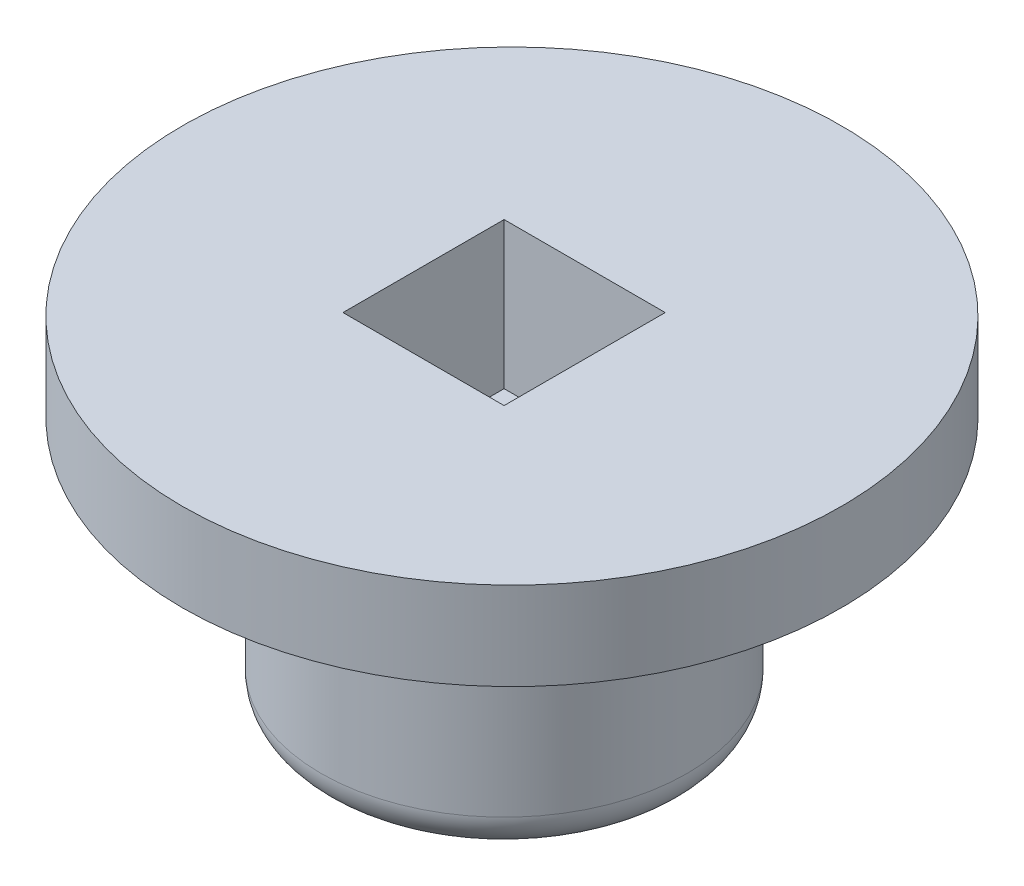
ISO-10303-21;
HEADER;
FILE_DESCRIPTION(('STEP AP214'),'2;1');
FILE_NAME('part.step','',(''),(''),'','','');
FILE_SCHEMA(('AUTOMOTIVE_DESIGN { 1 0 10303 214 1 1 1 1 }'));
ENDSEC;
DATA;
#1=APPLICATION_CONTEXT('core data for automotive mechanical design processes');
#2=APPLICATION_PROTOCOL_DEFINITION('international standard','automotive_design',2000,#1);
#3=PRODUCT_CONTEXT('',#1,'mechanical');
#4=PRODUCT('Part','Part','',(#3));
#5=PRODUCT_RELATED_PRODUCT_CATEGORY('part','',(#4));
#6=PRODUCT_DEFINITION_FORMATION('','',#4);
#7=PRODUCT_DEFINITION_CONTEXT('part definition',#1,'design');
#8=PRODUCT_DEFINITION('design','',#6,#7);
#9=PRODUCT_DEFINITION_SHAPE('','',#8);
#10=(LENGTH_UNIT() NAMED_UNIT(*) SI_UNIT(.MILLI.,.METRE.));
#11=(NAMED_UNIT(*) PLANE_ANGLE_UNIT() SI_UNIT($,.RADIAN.));
#12=(NAMED_UNIT(*) SI_UNIT($,.STERADIAN.) SOLID_ANGLE_UNIT());
#13=UNCERTAINTY_MEASURE_WITH_UNIT(LENGTH_MEASURE(1.E-05),#10,'distance_accuracy_value','');
#14=(GEOMETRIC_REPRESENTATION_CONTEXT(3) GLOBAL_UNCERTAINTY_ASSIGNED_CONTEXT((#13)) GLOBAL_UNIT_ASSIGNED_CONTEXT((#10,
#11,#12)) REPRESENTATION_CONTEXT('',''));
#15=CARTESIAN_POINT('',(0.,0.,0.));
#16=DIRECTION('',(0.,0.,1.));
#17=DIRECTION('',(1.,0.,0.));
#18=AXIS2_PLACEMENT_3D('',#15,#16,#17);
#19=CARTESIAN_POINT('',(0.,3.5,0.));
#20=DIRECTION('',(0.,-1.,0.));
#21=DIRECTION('',(0.,0.,-1.));
#22=AXIS2_PLACEMENT_3D('',#19,#20,#21);
#23=CYLINDRICAL_SURFACE('',#22,2.5);
#24=CARTESIAN_POINT('',(0.,0.5,0.));
#25=DIRECTION('',(0.,1.,0.));
#26=DIRECTION('',(0.,0.,1.));
#27=AXIS2_PLACEMENT_3D('',#24,#25,#26);
#28=CIRCLE('',#27,2.5);
#29=CARTESIAN_POINT('',(0.,0.5,2.5));
#30=VERTEX_POINT('',#29);
#31=EDGE_CURVE('E48',#30,#30,#28,.T.);
#32=ORIENTED_EDGE('',*,*,#31,.T.);
#33=EDGE_LOOP('',(#32));
#34=FACE_BOUND('',#33,.T.);
#35=CARTESIAN_POINT('',(0.,3.5,0.));
#36=DIRECTION('',(0.,1.,0.));
#37=DIRECTION('',(0.,0.,1.));
#38=AXIS2_PLACEMENT_3D('',#35,#36,#37);
#39=CIRCLE('',#38,2.5);
#40=CARTESIAN_POINT('',(0.,3.5,2.5));
#41=VERTEX_POINT('',#40);
#42=EDGE_CURVE('E135',#41,#41,#39,.T.);
#43=ORIENTED_EDGE('',*,*,#42,.F.);
#44=EDGE_LOOP('',(#43));
#45=FACE_BOUND('',#44,.T.);
#46=ADVANCED_FACE('F39',(#34,#45),#23,.T.);
#47=CARTESIAN_POINT('',(0.,0.,0.));
#48=DIRECTION('',(0.,1.,0.));
#49=DIRECTION('',(0.,0.,1.));
#50=AXIS2_PLACEMENT_3D('',#47,#48,#49);
#51=PLANE('',#50);
#52=CARTESIAN_POINT('',(0.,0.,0.));
#53=DIRECTION('',(0.,1.,0.));
#54=DIRECTION('',(0.,0.,1.));
#55=AXIS2_PLACEMENT_3D('',#52,#53,#54);
#56=CIRCLE('',#55,2.);
#57=CARTESIAN_POINT('',(0.,0.,2.));
#58=VERTEX_POINT('',#57);
#59=EDGE_CURVE('E11',#58,#58,#56,.F.);
#60=ORIENTED_EDGE('',*,*,#59,.T.);
#61=EDGE_LOOP('',(#60));
#62=FACE_BOUND('',#61,.T.);
#63=ADVANCED_FACE('F155',(#62),#51,.F.);
#64=CARTESIAN_POINT('',(0.0948799538174616,4.7,-0.0120273730239729));
#65=DIRECTION('',(0.,-1.,0.));
#66=DIRECTION('',(0.,0.,-1.));
#67=AXIS2_PLACEMENT_3D('',#64,#65,#66);
#68=CYLINDRICAL_SURFACE('',#67,4.5);
#69=CARTESIAN_POINT('',(0.0948799538174616,4.7,-0.0120273730239729));
#70=DIRECTION('',(0.,1.,0.));
#71=DIRECTION('',(0.,0.,1.));
#72=AXIS2_PLACEMENT_3D('',#69,#70,#71);
#73=CIRCLE('',#72,4.5);
#74=CARTESIAN_POINT('',(0.0948799538174616,4.7,4.48797262697603));
#75=VERTEX_POINT('',#74);
#76=EDGE_CURVE('E131',#75,#75,#73,.T.);
#77=ORIENTED_EDGE('',*,*,#76,.F.);
#78=EDGE_LOOP('',(#77));
#79=FACE_BOUND('',#78,.T.);
#80=CARTESIAN_POINT('',(0.0948799538174616,3.5,-0.0120273730239729));
#81=DIRECTION('',(0.,1.,0.));
#82=DIRECTION('',(0.,0.,1.));
#83=AXIS2_PLACEMENT_3D('',#80,#81,#82);
#84=CIRCLE('',#83,4.5);
#85=CARTESIAN_POINT('',(0.0948799538174616,3.5,4.48797262697603));
#86=VERTEX_POINT('',#85);
#87=EDGE_CURVE('E126',#86,#86,#84,.T.);
#88=ORIENTED_EDGE('',*,*,#87,.T.);
#89=EDGE_LOOP('',(#88));
#90=FACE_BOUND('',#89,.T.);
#91=ADVANCED_FACE('F159',(#79,#90),#68,.T.);
#92=CARTESIAN_POINT('',(0.0948799538174616,4.7,-0.0120273730239729));
#93=DIRECTION('',(0.,1.,0.));
#94=DIRECTION('',(0.,0.,1.));
#95=AXIS2_PLACEMENT_3D('',#92,#93,#94);
#96=PLANE('',#95);
#97=DIRECTION('',(0.,0.,1.));
#98=VECTOR('',#97,1.);
#99=CARTESIAN_POINT('',(-1.1,4.7,1.1));
#100=LINE('',#99,#98);
#101=CARTESIAN_POINT('',(-1.1,4.7,-1.1));
#102=VERTEX_POINT('',#101);
#103=CARTESIAN_POINT('',(-1.1,4.7,1.1));
#104=VERTEX_POINT('',#103);
#105=EDGE_CURVE('E55',#102,#104,#100,.T.);
#106=ORIENTED_EDGE('',*,*,#105,.F.);
#107=DIRECTION('',(-1.,0.,0.));
#108=VECTOR('',#107,1.);
#109=CARTESIAN_POINT('',(1.1,4.7,-1.1));
#110=LINE('',#109,#108);
#111=CARTESIAN_POINT('',(1.1,4.7,-1.1));
#112=VERTEX_POINT('',#111);
#113=EDGE_CURVE('E110',#112,#102,#110,.T.);
#114=ORIENTED_EDGE('',*,*,#113,.F.);
#115=DIRECTION('',(0.,0.,-1.));
#116=VECTOR('',#115,1.);
#117=CARTESIAN_POINT('',(1.1,4.7,1.1));
#118=LINE('',#117,#116);
#119=CARTESIAN_POINT('',(1.1,4.7,1.1));
#120=VERTEX_POINT('',#119);
#121=EDGE_CURVE('E119',#120,#112,#118,.T.);
#122=ORIENTED_EDGE('',*,*,#121,.F.);
#123=DIRECTION('',(1.,0.,0.));
#124=VECTOR('',#123,1.);
#125=CARTESIAN_POINT('',(1.1,4.7,1.1));
#126=LINE('',#125,#124);
#127=EDGE_CURVE('E90',#104,#120,#126,.T.);
#128=ORIENTED_EDGE('',*,*,#127,.F.);
#129=EDGE_LOOP('',(#106,#114,#122,#128));
#130=FACE_BOUND('',#129,.T.);
#131=ORIENTED_EDGE('',*,*,#76,.T.);
#132=EDGE_LOOP('',(#131));
#133=FACE_BOUND('',#132,.T.);
#134=ADVANCED_FACE('F165',(#130,#133),#96,.T.);
#135=CARTESIAN_POINT('',(0.0948799538174616,3.5,-0.0120273730239729));
#136=DIRECTION('',(0.,1.,0.));
#137=DIRECTION('',(0.,0.,1.));
#138=AXIS2_PLACEMENT_3D('',#135,#136,#137);
#139=PLANE('',#138);
#140=ORIENTED_EDGE('',*,*,#42,.T.);
#141=EDGE_LOOP('',(#140));
#142=FACE_BOUND('',#141,.T.);
#143=ORIENTED_EDGE('',*,*,#87,.F.);
#144=EDGE_LOOP('',(#143));
#145=FACE_BOUND('',#144,.T.);
#146=ADVANCED_FACE('F167',(#142,#145),#139,.F.);
#147=CARTESIAN_POINT('',(-1.1,2.7,1.1));
#148=DIRECTION('',(-1.,0.,0.));
#149=DIRECTION('',(0.,0.,1.));
#150=AXIS2_PLACEMENT_3D('',#147,#148,#149);
#151=PLANE('',#150);
#152=ORIENTED_EDGE('',*,*,#105,.T.);
#153=DIRECTION('',(0.,1.,0.));
#154=VECTOR('',#153,1.);
#155=CARTESIAN_POINT('',(-1.1,2.7,1.1));
#156=LINE('',#155,#154);
#157=CARTESIAN_POINT('',(-1.1,2.7,1.1));
#158=VERTEX_POINT('',#157);
#159=EDGE_CURVE('E78',#158,#104,#156,.T.);
#160=ORIENTED_EDGE('',*,*,#159,.F.);
#161=DIRECTION('',(0.,0.,1.));
#162=VECTOR('',#161,1.);
#163=CARTESIAN_POINT('',(-1.1,2.7,1.1));
#164=LINE('',#163,#162);
#165=CARTESIAN_POINT('',(-1.1,2.7,-1.1));
#166=VERTEX_POINT('',#165);
#167=EDGE_CURVE('E106',#166,#158,#164,.T.);
#168=ORIENTED_EDGE('',*,*,#167,.F.);
#169=DIRECTION('',(0.,1.,0.));
#170=VECTOR('',#169,1.);
#171=CARTESIAN_POINT('',(-1.1,2.7,-1.1));
#172=LINE('',#171,#170);
#173=EDGE_CURVE('E63',#166,#102,#172,.T.);
#174=ORIENTED_EDGE('',*,*,#173,.T.);
#175=EDGE_LOOP('',(#152,#160,#168,#174));
#176=FACE_BOUND('',#175,.T.);
#177=ADVANCED_FACE('F170',(#176),#151,.F.);
#178=CARTESIAN_POINT('',(1.1,2.7,-1.1));
#179=DIRECTION('',(0.,0.,-1.));
#180=DIRECTION('',(-1.,0.,0.));
#181=AXIS2_PLACEMENT_3D('',#178,#179,#180);
#182=PLANE('',#181);
#183=ORIENTED_EDGE('',*,*,#113,.T.);
#184=ORIENTED_EDGE('',*,*,#173,.F.);
#185=DIRECTION('',(-1.,0.,0.));
#186=VECTOR('',#185,1.);
#187=CARTESIAN_POINT('',(1.1,2.7,-1.1));
#188=LINE('',#187,#186);
#189=CARTESIAN_POINT('',(1.1,2.7,-1.1));
#190=VERTEX_POINT('',#189);
#191=EDGE_CURVE('E103',#190,#166,#188,.T.);
#192=ORIENTED_EDGE('',*,*,#191,.F.);
#193=DIRECTION('',(0.,1.,0.));
#194=VECTOR('',#193,1.);
#195=CARTESIAN_POINT('',(1.1,2.7,-1.1));
#196=LINE('',#195,#194);
#197=EDGE_CURVE('E95',#190,#112,#196,.T.);
#198=ORIENTED_EDGE('',*,*,#197,.T.);
#199=EDGE_LOOP('',(#183,#184,#192,#198));
#200=FACE_BOUND('',#199,.T.);
#201=ADVANCED_FACE('F177',(#200),#182,.F.);
#202=CARTESIAN_POINT('',(1.1,2.7,1.1));
#203=DIRECTION('',(1.,0.,0.));
#204=DIRECTION('',(0.,0.,-1.));
#205=AXIS2_PLACEMENT_3D('',#202,#203,#204);
#206=PLANE('',#205);
#207=ORIENTED_EDGE('',*,*,#121,.T.);
#208=ORIENTED_EDGE('',*,*,#197,.F.);
#209=DIRECTION('',(0.,0.,-1.));
#210=VECTOR('',#209,1.);
#211=CARTESIAN_POINT('',(1.1,2.7,1.1));
#212=LINE('',#211,#210);
#213=CARTESIAN_POINT('',(1.1,2.7,1.1));
#214=VERTEX_POINT('',#213);
#215=EDGE_CURVE('E98',#214,#190,#212,.T.);
#216=ORIENTED_EDGE('',*,*,#215,.F.);
#217=DIRECTION('',(0.,1.,0.));
#218=VECTOR('',#217,1.);
#219=CARTESIAN_POINT('',(1.1,2.7,1.1));
#220=LINE('',#219,#218);
#221=EDGE_CURVE('E83',#214,#120,#220,.T.);
#222=ORIENTED_EDGE('',*,*,#221,.T.);
#223=EDGE_LOOP('',(#207,#208,#216,#222));
#224=FACE_BOUND('',#223,.T.);
#225=ADVANCED_FACE('F99',(#224),#206,.F.);
#226=CARTESIAN_POINT('',(1.1,2.7,1.1));
#227=DIRECTION('',(0.,0.,1.));
#228=DIRECTION('',(1.,0.,0.));
#229=AXIS2_PLACEMENT_3D('',#226,#227,#228);
#230=PLANE('',#229);
#231=ORIENTED_EDGE('',*,*,#127,.T.);
#232=ORIENTED_EDGE('',*,*,#221,.F.);
#233=DIRECTION('',(1.,0.,0.));
#234=VECTOR('',#233,1.);
#235=CARTESIAN_POINT('',(1.1,2.7,1.1));
#236=LINE('',#235,#234);
#237=EDGE_CURVE('E87',#158,#214,#236,.T.);
#238=ORIENTED_EDGE('',*,*,#237,.F.);
#239=ORIENTED_EDGE('',*,*,#159,.T.);
#240=EDGE_LOOP('',(#231,#232,#238,#239));
#241=FACE_BOUND('',#240,.T.);
#242=ADVANCED_FACE('F85',(#241),#230,.F.);
#243=CARTESIAN_POINT('',(0.,2.7,0.));
#244=DIRECTION('',(0.,1.,0.));
#245=DIRECTION('',(0.,0.,1.));
#246=AXIS2_PLACEMENT_3D('',#243,#244,#245);
#247=PLANE('',#246);
#248=ORIENTED_EDGE('',*,*,#167,.T.);
#249=ORIENTED_EDGE('',*,*,#237,.T.);
#250=ORIENTED_EDGE('',*,*,#215,.T.);
#251=ORIENTED_EDGE('',*,*,#191,.T.);
#252=EDGE_LOOP('',(#248,#249,#250,#251));
#253=FACE_BOUND('',#252,.T.);
#254=ADVANCED_FACE('F105',(#253),#247,.T.);
#255=CARTESIAN_POINT('',(0.,0.5,0.));
#256=DIRECTION('',(0.,1.,0.));
#257=DIRECTION('',(0.,0.,1.));
#258=AXIS2_PLACEMENT_3D('',#255,#256,#257);
#259=TOROIDAL_SURFACE('',#258,2.,0.5);
#260=ORIENTED_EDGE('',*,*,#59,.F.);
#261=EDGE_LOOP('',(#260));
#262=FACE_BOUND('',#261,.T.);
#263=ORIENTED_EDGE('',*,*,#31,.F.);
#264=EDGE_LOOP('',(#263));
#265=FACE_BOUND('',#264,.T.);
#266=ADVANCED_FACE('F41',(#262,#265),#259,.T.);
#267=CLOSED_SHELL('',(#46,#63,#91,#134,#146,#177,#201,#225,#242,#254,#266));
#268=MANIFOLD_SOLID_BREP('B2',#267);
#269=ADVANCED_BREP_SHAPE_REPRESENTATION('',(#18,#268),#14);
#270=SHAPE_DEFINITION_REPRESENTATION(#9,#269);
ENDSEC;
END-ISO-10303-21;
